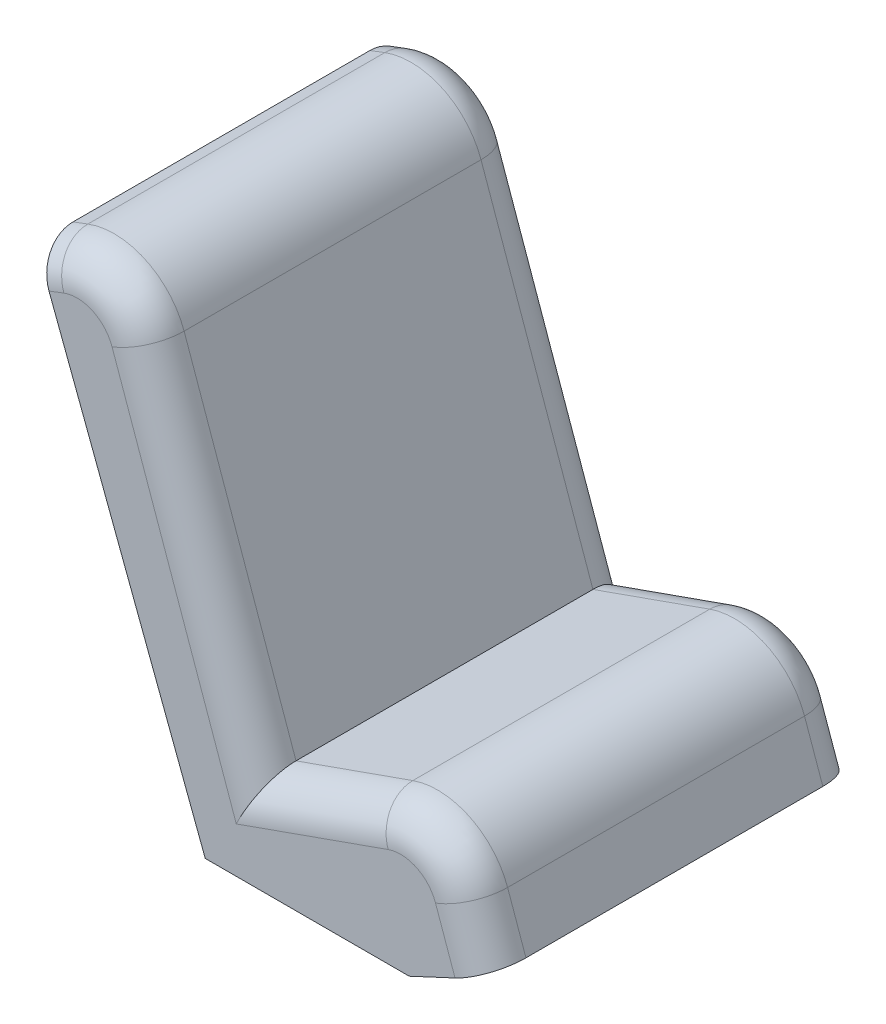
ISO-10303-21;
HEADER;
FILE_DESCRIPTION(('STEP AP214'),'2;1');
FILE_NAME('part.step','',(''),(''),'','','');
FILE_SCHEMA(('AUTOMOTIVE_DESIGN { 1 0 10303 214 1 1 1 1 }'));
ENDSEC;
DATA;
#1=APPLICATION_CONTEXT('core data for automotive mechanical design processes');
#2=APPLICATION_PROTOCOL_DEFINITION('international standard','automotive_design',2000,#1);
#3=PRODUCT_CONTEXT('',#1,'mechanical');
#4=PRODUCT('Part','Part','',(#3));
#5=PRODUCT_RELATED_PRODUCT_CATEGORY('part','',(#4));
#6=PRODUCT_DEFINITION_FORMATION('','',#4);
#7=PRODUCT_DEFINITION_CONTEXT('part definition',#1,'design');
#8=PRODUCT_DEFINITION('design','',#6,#7);
#9=PRODUCT_DEFINITION_SHAPE('','',#8);
#10=(LENGTH_UNIT() NAMED_UNIT(*) SI_UNIT(.MILLI.,.METRE.));
#11=(NAMED_UNIT(*) PLANE_ANGLE_UNIT() SI_UNIT($,.RADIAN.));
#12=(NAMED_UNIT(*) SI_UNIT($,.STERADIAN.) SOLID_ANGLE_UNIT());
#13=UNCERTAINTY_MEASURE_WITH_UNIT(LENGTH_MEASURE(1.E-05),#10,'distance_accuracy_value','');
#14=(GEOMETRIC_REPRESENTATION_CONTEXT(3) GLOBAL_UNCERTAINTY_ASSIGNED_CONTEXT((#13)) GLOBAL_UNIT_ASSIGNED_CONTEXT((#10,
#11,#12)) REPRESENTATION_CONTEXT('',''));
#15=CARTESIAN_POINT('',(0.,0.,0.));
#16=DIRECTION('',(0.,0.,1.));
#17=DIRECTION('',(1.,0.,0.));
#18=AXIS2_PLACEMENT_3D('',#15,#16,#17);
#19=CARTESIAN_POINT('',(-39.4836722180552,122.226530820295,50.));
#20=DIRECTION('',(0.353666770270367,-0.935371485350354,0.));
#21=DIRECTION('',(0.935371485350354,0.353666770270367,0.));
#22=AXIS2_PLACEMENT_3D('',#19,#20,#21);
#23=PLANE('',#22);
#24=DIRECTION('',(-0.935371485350354,-0.353666770270367,0.));
#25=VECTOR('',#24,1.);
#26=CARTESIAN_POINT('',(-39.4836722180552,122.226530820295,-40.));
#27=LINE('',#26,#25);
#28=CARTESIAN_POINT('',(-39.4836722180552,122.226530820295,-40.));
#29=VERTEX_POINT('',#28);
#30=CARTESIAN_POINT('',(-43.5016177406668,120.707333540541,-40.));
#31=VERTEX_POINT('',#30);
#32=EDGE_CURVE('E259',#29,#31,#27,.T.);
#33=ORIENTED_EDGE('',*,*,#32,.T.);
#34=DIRECTION('',(0.,0.,1.));
#35=VECTOR('',#34,1.);
#36=CARTESIAN_POINT('',(-43.5016177406668,120.707333540541,50.));
#37=LINE('',#36,#35);
#38=CARTESIAN_POINT('',(-43.5016177406668,120.707333540541,40.));
#39=VERTEX_POINT('',#38);
#40=EDGE_CURVE('E57',#31,#39,#37,.T.);
#41=ORIENTED_EDGE('',*,*,#40,.T.);
#42=DIRECTION('',(-0.935371485350354,-0.353666770270367,0.));
#43=VECTOR('',#42,1.);
#44=CARTESIAN_POINT('',(-39.4836722180552,122.226530820295,40.));
#45=LINE('',#44,#43);
#46=CARTESIAN_POINT('',(-39.4836722180552,122.226530820295,40.));
#47=VERTEX_POINT('',#46);
#48=EDGE_CURVE('E257',#39,#47,#45,.F.);
#49=ORIENTED_EDGE('',*,*,#48,.T.);
#50=DIRECTION('',(0.,0.,-1.));
#51=VECTOR('',#50,1.);
#52=CARTESIAN_POINT('',(-39.4836722180552,122.226530820295,50.));
#53=LINE('',#52,#51);
#54=EDGE_CURVE('E194',#47,#29,#53,.T.);
#55=ORIENTED_EDGE('',*,*,#54,.T.);
#56=EDGE_LOOP('',(#33,#41,#49,#55));
#57=FACE_BOUND('',#56,.T.);
#58=ADVANCED_FACE('F33',(#57),#23,.F.);
#59=CARTESIAN_POINT('',(-45.3723607113675,120.,50.));
#60=DIRECTION('',(0.935371485350354,0.353666770270366,0.));
#61=DIRECTION('',(-0.353666770270366,0.935371485350355,0.));
#62=AXIS2_PLACEMENT_3D('',#59,#60,#61);
#63=PLANE('',#62);
#64=CARTESIAN_POINT('',(-41.8356930086638,110.646285146496,-40.));
#65=DIRECTION('',(0.935371485350354,0.353666770270366,0.));
#66=DIRECTION('',(-0.353666770270366,0.935371485350355,0.));
#67=AXIS2_PLACEMENT_3D('',#64,#65,#66);
#68=CIRCLE('',#67,7.99999999999999);
#69=CARTESIAN_POINT('',(-44.6650271708267,118.129257029299,-40.));
#70=VERTEX_POINT('',#69);
#71=CARTESIAN_POINT('',(-41.8356930086638,110.646285146496,-48.));
#72=VERTEX_POINT('',#71);
#73=EDGE_CURVE('E307',#70,#72,#68,.F.);
#74=ORIENTED_EDGE('',*,*,#73,.T.);
#75=DIRECTION('',(0.353666770270366,-0.935371485350355,0.));
#76=VECTOR('',#75,1.);
#77=CARTESIAN_POINT('',(-45.3723607113675,120.,-48.));
#78=LINE('',#77,#76);
#79=CARTESIAN_POINT('',(0.,0.,-48.));
#80=VERTEX_POINT('',#79);
#81=EDGE_CURVE('E309',#72,#80,#78,.T.);
#82=ORIENTED_EDGE('',*,*,#81,.T.);
#83=DIRECTION('',(0.,0.,-1.));
#84=VECTOR('',#83,1.);
#85=CARTESIAN_POINT('',(0.,0.,50.));
#86=LINE('',#85,#84);
#87=CARTESIAN_POINT('',(0.,0.,48.));
#88=VERTEX_POINT('',#87);
#89=EDGE_CURVE('E187',#88,#80,#86,.T.);
#90=ORIENTED_EDGE('',*,*,#89,.F.);
#91=DIRECTION('',(-0.353666770270366,0.935371485350355,0.));
#92=VECTOR('',#91,1.);
#93=CARTESIAN_POINT('',(-41.8356930086638,110.646285146496,48.));
#94=LINE('',#93,#92);
#95=CARTESIAN_POINT('',(-41.8356930086638,110.646285146496,48.));
#96=VERTEX_POINT('',#95);
#97=EDGE_CURVE('E273',#88,#96,#94,.T.);
#98=ORIENTED_EDGE('',*,*,#97,.T.);
#99=CARTESIAN_POINT('',(-41.8356930086638,110.646285146496,40.));
#100=DIRECTION('',(0.935371485350354,0.353666770270366,0.));
#101=DIRECTION('',(-0.353666770270366,0.935371485350355,0.));
#102=AXIS2_PLACEMENT_3D('',#99,#100,#101);
#103=CIRCLE('',#102,8.);
#104=CARTESIAN_POINT('',(-44.6650271708267,118.129257029299,40.));
#105=VERTEX_POINT('',#104);
#106=EDGE_CURVE('E303',#96,#105,#103,.F.);
#107=ORIENTED_EDGE('',*,*,#106,.T.);
#108=DIRECTION('',(0.,0.,-1.));
#109=VECTOR('',#108,1.);
#110=CARTESIAN_POINT('',(-44.6650271708267,118.129257029299,50.));
#111=LINE('',#110,#109);
#112=EDGE_CURVE('E305',#105,#70,#111,.T.);
#113=ORIENTED_EDGE('',*,*,#112,.T.);
#114=EDGE_LOOP('',(#74,#82,#90,#98,#107,#113));
#115=FACE_BOUND('',#114,.T.);
#116=ADVANCED_FACE('F341',(#115),#63,.F.);
#117=CARTESIAN_POINT('',(0.,0.,50.));
#118=DIRECTION('',(0.,1.,0.));
#119=DIRECTION('',(0.,0.,1.));
#120=AXIS2_PLACEMENT_3D('',#117,#118,#119);
#121=PLANE('',#120);
#122=CARTESIAN_POINT('',(30.,0.,0.));
#123=DIRECTION('',(0.,1.,0.));
#124=DIRECTION('',(0.,0.,1.));
#125=AXIS2_PLACEMENT_3D('',#122,#123,#124);
#126=CIRCLE('',#125,7.5);
#127=CARTESIAN_POINT('',(30.,0.,7.5));
#128=VERTEX_POINT('',#127);
#129=EDGE_CURVE('E218',#128,#128,#126,.F.);
#130=ORIENTED_EDGE('',*,*,#129,.F.);
#131=EDGE_LOOP('',(#130));
#132=FACE_BOUND('',#131,.T.);
#133=ORIENTED_EDGE('',*,*,#89,.T.);
#134=DIRECTION('',(-0.730312359414806,0.,0.683113356395539));
#135=VECTOR('',#134,1.);
#136=CARTESIAN_POINT('',(-24.1996272766952,0.,-25.364358689273));
#137=LINE('',#136,#135);
#138=CARTESIAN_POINT('',(2.13818790857292,0.,-50.));
#139=VERTEX_POINT('',#138);
#140=EDGE_CURVE('E314',#80,#139,#137,.F.);
#141=ORIENTED_EDGE('',*,*,#140,.T.);
#142=DIRECTION('',(1.,0.,0.));
#143=VECTOR('',#142,1.);
#144=CARTESIAN_POINT('',(0.,0.,-50.));
#145=LINE('',#144,#143);
#146=CARTESIAN_POINT('',(57.1,0.,-50.));
#147=VERTEX_POINT('',#146);
#148=EDGE_CURVE('E183',#139,#147,#145,.T.);
#149=ORIENTED_EDGE('',*,*,#148,.T.);
#150=DIRECTION('',(0.,0.,-1.));
#151=VECTOR('',#150,1.);
#152=CARTESIAN_POINT('',(57.1,0.,50.));
#153=LINE('',#152,#151);
#154=CARTESIAN_POINT('',(57.1,0.,50.));
#155=VERTEX_POINT('',#154);
#156=EDGE_CURVE('E179',#155,#147,#153,.T.);
#157=ORIENTED_EDGE('',*,*,#156,.F.);
#158=DIRECTION('',(1.,0.,0.));
#159=VECTOR('',#158,1.);
#160=CARTESIAN_POINT('',(0.,0.,50.));
#161=LINE('',#160,#159);
#162=CARTESIAN_POINT('',(2.13818790857292,0.,50.));
#163=VERTEX_POINT('',#162);
#164=EDGE_CURVE('E166',#163,#155,#161,.T.);
#165=ORIENTED_EDGE('',*,*,#164,.F.);
#166=DIRECTION('',(-0.730312359414806,0.,-0.683113356395539));
#167=VECTOR('',#166,1.);
#168=CARTESIAN_POINT('',(2.5977246242426,0.,50.429837540309));
#169=LINE('',#168,#167);
#170=EDGE_CURVE('E312',#163,#88,#169,.T.);
#171=ORIENTED_EDGE('',*,*,#170,.T.);
#172=EDGE_LOOP('',(#133,#141,#149,#157,#165,#171));
#173=FACE_BOUND('',#172,.T.);
#174=ADVANCED_FACE('F181',(#132,#173),#121,.F.);
#175=CARTESIAN_POINT('',(57.1,0.,50.));
#176=DIRECTION('',(-0.422618261740701,0.906307787036649,0.));
#177=DIRECTION('',(-0.906307787036649,-0.422618261740701,0.));
#178=AXIS2_PLACEMENT_3D('',#175,#176,#177);
#179=PLANE('',#178);
#180=DIRECTION('',(0.906307787036649,0.422618261740701,0.));
#181=VECTOR('',#180,1.);
#182=CARTESIAN_POINT('',(57.1,0.,-50.));
#183=LINE('',#182,#181);
#184=CARTESIAN_POINT('',(69.4398904161345,5.75418540183703,-50.));
#185=VERTEX_POINT('',#184);
#186=EDGE_CURVE('E176',#147,#185,#183,.T.);
#187=ORIENTED_EDGE('',*,*,#186,.T.);
#188=CARTESIAN_POINT('',(69.4398904161345,5.75418540183703,-40.));
#189=DIRECTION('',(-0.422618261740701,0.906307787036649,0.));
#190=DIRECTION('',(0.906307787036649,0.422618261740701,0.));
#191=AXIS2_PLACEMENT_3D('',#188,#189,#190);
#192=ELLIPSE('',#191,10.0464532239452,10.);
#193=CARTESIAN_POINT('',(78.5450692050955,10.,-40.));
#194=VERTEX_POINT('',#193);
#195=EDGE_CURVE('E239',#185,#194,#192,.F.);
#196=ORIENTED_EDGE('',*,*,#195,.T.);
#197=DIRECTION('',(0.,0.,-1.));
#198=VECTOR('',#197,1.);
#199=CARTESIAN_POINT('',(78.5450692050955,10.,50.));
#200=LINE('',#199,#198);
#201=CARTESIAN_POINT('',(78.5450692050955,10.,40.));
#202=VERTEX_POINT('',#201);
#203=EDGE_CURVE('E188',#202,#194,#200,.T.);
#204=ORIENTED_EDGE('',*,*,#203,.F.);
#205=CARTESIAN_POINT('',(69.4398904161345,5.75418540183703,40.));
#206=DIRECTION('',(-0.422618261740701,0.906307787036649,0.));
#207=DIRECTION('',(-0.906307787036649,-0.422618261740701,0.));
#208=AXIS2_PLACEMENT_3D('',#205,#206,#207);
#209=ELLIPSE('',#208,10.0464532239452,10.);
#210=CARTESIAN_POINT('',(69.4398904161345,5.75418540183703,50.));
#211=VERTEX_POINT('',#210);
#212=EDGE_CURVE('E193',#202,#211,#209,.F.);
#213=ORIENTED_EDGE('',*,*,#212,.T.);
#214=DIRECTION('',(0.906307787036649,0.422618261740701,0.));
#215=VECTOR('',#214,1.);
#216=CARTESIAN_POINT('',(57.1,0.,50.));
#217=LINE('',#216,#215);
#218=EDGE_CURVE('E171',#155,#211,#217,.T.);
#219=ORIENTED_EDGE('',*,*,#218,.F.);
#220=ORIENTED_EDGE('',*,*,#156,.T.);
#221=EDGE_LOOP('',(#187,#196,#204,#213,#219,#220));
#222=FACE_BOUND('',#221,.T.);
#223=ADVANCED_FACE('F190',(#222),#179,.F.);
#224=CARTESIAN_POINT('',(78.5450692050955,10.,50.));
#225=DIRECTION('',(-0.942711194520251,-0.333609957474595,0.));
#226=DIRECTION('',(0.333609957474595,-0.942711194520251,0.));
#227=AXIS2_PLACEMENT_3D('',#224,#225,#226);
#228=PLANE('',#227);
#229=ORIENTED_EDGE('',*,*,#203,.T.);
#230=DIRECTION('',(-0.333609957474595,0.942711194520251,0.));
#231=VECTOR('',#230,1.);
#232=CARTESIAN_POINT('',(78.5450692050955,10.,-40.));
#233=LINE('',#232,#231);
#234=CARTESIAN_POINT('',(73.6046613708874,23.9605478387383,-40.));
#235=VERTEX_POINT('',#234);
#236=EDGE_CURVE('E223',#194,#235,#233,.T.);
#237=ORIENTED_EDGE('',*,*,#236,.T.);
#238=DIRECTION('',(0.,0.,-1.));
#239=VECTOR('',#238,1.);
#240=CARTESIAN_POINT('',(73.6046613708874,23.9605478387383,50.));
#241=LINE('',#240,#239);
#242=CARTESIAN_POINT('',(73.6046613708874,23.9605478387383,40.));
#243=VERTEX_POINT('',#242);
#244=EDGE_CURVE('E212',#243,#235,#241,.T.);
#245=ORIENTED_EDGE('',*,*,#244,.F.);
#246=DIRECTION('',(-0.333609957474595,0.942711194520251,0.));
#247=VECTOR('',#246,1.);
#248=CARTESIAN_POINT('',(78.5450692050955,10.,40.));
#249=LINE('',#248,#247);
#250=EDGE_CURVE('E221',#243,#202,#249,.F.);
#251=ORIENTED_EDGE('',*,*,#250,.T.);
#252=EDGE_LOOP('',(#229,#237,#245,#251));
#253=FACE_BOUND('',#252,.T.);
#254=ADVANCED_FACE('F360',(#253),#228,.F.);
#255=CARTESIAN_POINT('',(54.7504374804824,17.2883486892464,50.));
#256=DIRECTION('',(0.,0.,-1.));
#257=DIRECTION('',(-1.,0.,0.));
#258=AXIS2_PLACEMENT_3D('',#255,#256,#257);
#259=CYLINDRICAL_SURFACE('',#258,20.);
#260=ORIENTED_EDGE('',*,*,#244,.T.);
#261=CARTESIAN_POINT('',(54.7504374804824,17.2883486892464,-40.));
#262=DIRECTION('',(0.,0.,1.));
#263=DIRECTION('',(1.,0.,0.));
#264=AXIS2_PLACEMENT_3D('',#261,#262,#263);
#265=CIRCLE('',#264,20.);
#266=CARTESIAN_POINT('',(48.0782383309905,36.1425725796514,-40.));
#267=VERTEX_POINT('',#266);
#268=EDGE_CURVE('E243',#235,#267,#265,.T.);
#269=ORIENTED_EDGE('',*,*,#268,.T.);
#270=DIRECTION('',(0.,0.,-1.));
#271=VECTOR('',#270,1.);
#272=CARTESIAN_POINT('',(48.0782383309905,36.1425725796514,50.));
#273=LINE('',#272,#271);
#274=CARTESIAN_POINT('',(48.0782383309905,36.1425725796514,40.));
#275=VERTEX_POINT('',#274);
#276=EDGE_CURVE('E209',#275,#267,#273,.T.);
#277=ORIENTED_EDGE('',*,*,#276,.F.);
#278=CARTESIAN_POINT('',(54.7504374804824,17.2883486892464,40.));
#279=DIRECTION('',(0.,0.,1.));
#280=DIRECTION('',(1.,0.,0.));
#281=AXIS2_PLACEMENT_3D('',#278,#279,#280);
#282=CIRCLE('',#281,20.);
#283=EDGE_CURVE('E241',#275,#243,#282,.F.);
#284=ORIENTED_EDGE('',*,*,#283,.T.);
#285=EDGE_LOOP('',(#260,#269,#277,#284));
#286=FACE_BOUND('',#285,.T.);
#287=ADVANCED_FACE('F363',(#286),#259,.T.);
#288=CARTESIAN_POINT('',(48.0782383309905,36.1425725796514,50.));
#289=DIRECTION('',(0.333609957474594,-0.942711194520252,0.));
#290=DIRECTION('',(0.942711194520252,0.333609957474594,0.));
#291=AXIS2_PLACEMENT_3D('',#288,#289,#290);
#292=PLANE('',#291);
#293=ORIENTED_EDGE('',*,*,#276,.T.);
#294=DIRECTION('',(-0.942711194520252,-0.333609957474594,0.));
#295=VECTOR('',#294,1.);
#296=CARTESIAN_POINT('',(48.0782383309905,36.1425725796514,-40.));
#297=LINE('',#296,#295);
#298=CARTESIAN_POINT('',(16.5916844340141,25.,-40.));
#299=VERTEX_POINT('',#298);
#300=EDGE_CURVE('E267',#267,#299,#297,.T.);
#301=ORIENTED_EDGE('',*,*,#300,.T.);
#302=DIRECTION('',(0.,0.,-1.));
#303=VECTOR('',#302,1.);
#304=CARTESIAN_POINT('',(16.5916844340141,25.,50.));
#305=LINE('',#304,#303);
#306=CARTESIAN_POINT('',(16.5916844340141,25.,40.));
#307=VERTEX_POINT('',#306);
#308=EDGE_CURVE('E206',#307,#299,#305,.T.);
#309=ORIENTED_EDGE('',*,*,#308,.F.);
#310=DIRECTION('',(-0.942711194520252,-0.333609957474594,0.));
#311=VECTOR('',#310,1.);
#312=CARTESIAN_POINT('',(48.0782383309905,36.1425725796514,40.));
#313=LINE('',#312,#311);
#314=EDGE_CURVE('E265',#307,#275,#313,.F.);
#315=ORIENTED_EDGE('',*,*,#314,.T.);
#316=EDGE_LOOP('',(#293,#301,#309,#315));
#317=FACE_BOUND('',#316,.T.);
#318=ADVANCED_FACE('F602',(#317),#292,.F.);
#319=CARTESIAN_POINT('',(16.5916844340141,25.,50.));
#320=DIRECTION('',(-0.942711194520251,-0.333609957474595,0.));
#321=DIRECTION('',(0.333609957474595,-0.942711194520251,0.));
#322=AXIS2_PLACEMENT_3D('',#319,#320,#321);
#323=PLANE('',#322);
#324=ORIENTED_EDGE('',*,*,#308,.T.);
#325=DIRECTION('',(-0.333609957474595,0.942711194520251,0.));
#326=VECTOR('',#325,1.);
#327=CARTESIAN_POINT('',(16.5916844340141,25.,-40.));
#328=LINE('',#327,#326);
#329=CARTESIAN_POINT('',(-13.5561129222429,110.19130026278,-40.));
#330=VERTEX_POINT('',#329);
#331=EDGE_CURVE('E271',#299,#330,#328,.T.);
#332=ORIENTED_EDGE('',*,*,#331,.T.);
#333=DIRECTION('',(0.,0.,-1.));
#334=VECTOR('',#333,1.);
#335=CARTESIAN_POINT('',(-13.5561129222429,110.19130026278,50.));
#336=LINE('',#335,#334);
#337=CARTESIAN_POINT('',(-13.5561129222429,110.19130026278,40.));
#338=VERTEX_POINT('',#337);
#339=EDGE_CURVE('E197',#338,#330,#336,.T.);
#340=ORIENTED_EDGE('',*,*,#339,.F.);
#341=DIRECTION('',(-0.333609957474595,0.942711194520251,0.));
#342=VECTOR('',#341,1.);
#343=CARTESIAN_POINT('',(16.5916844340141,25.,40.));
#344=LINE('',#343,#342);
#345=EDGE_CURVE('E269',#338,#307,#344,.F.);
#346=ORIENTED_EDGE('',*,*,#345,.T.);
#347=EDGE_LOOP('',(#324,#332,#340,#346));
#348=FACE_BOUND('',#347,.T.);
#349=ADVANCED_FACE('F594',(#348),#323,.F.);
#350=CARTESIAN_POINT('',(-32.4103368126477,103.519101113288,50.));
#351=DIRECTION('',(0.,0.,-1.));
#352=DIRECTION('',(-1.,0.,0.));
#353=AXIS2_PLACEMENT_3D('',#350,#351,#352);
#354=CYLINDRICAL_SURFACE('',#353,19.9999999999999);
#355=ORIENTED_EDGE('',*,*,#339,.T.);
#356=CARTESIAN_POINT('',(-32.4103368126477,103.519101113288,-40.));
#357=DIRECTION('',(0.,0.,1.));
#358=DIRECTION('',(1.,0.,0.));
#359=AXIS2_PLACEMENT_3D('',#356,#357,#358);
#360=CIRCLE('',#359,19.9999999999999);
#361=EDGE_CURVE('E263',#330,#29,#360,.T.);
#362=ORIENTED_EDGE('',*,*,#361,.T.);
#363=ORIENTED_EDGE('',*,*,#54,.F.);
#364=CARTESIAN_POINT('',(-32.4103368126477,103.519101113288,40.));
#365=DIRECTION('',(0.,0.,1.));
#366=DIRECTION('',(1.,0.,0.));
#367=AXIS2_PLACEMENT_3D('',#364,#365,#366);
#368=CIRCLE('',#367,19.9999999999999);
#369=EDGE_CURVE('E261',#47,#338,#368,.F.);
#370=ORIENTED_EDGE('',*,*,#369,.T.);
#371=EDGE_LOOP('',(#355,#362,#363,#370));
#372=FACE_BOUND('',#371,.T.);
#373=ADVANCED_FACE('F392',(#372),#354,.T.);
#374=CARTESIAN_POINT('',(54.7504374804824,17.2883486892464,50.));
#375=DIRECTION('',(0.,0.,1.));
#376=DIRECTION('',(1.,0.,0.));
#377=AXIS2_PLACEMENT_3D('',#374,#375,#376);
#378=PLANE('',#377);
#379=DIRECTION('',(-0.935371485350354,-0.353666770270367,0.));
#380=VECTOR('',#379,1.);
#381=CARTESIAN_POINT('',(-41.8356930086638,110.646285146496,50.));
#382=LINE('',#381,#380);
#383=CARTESIAN_POINT('',(-35.9470045153515,112.872815966792,50.));
#384=VERTEX_POINT('',#383);
#385=CARTESIAN_POINT('',(-39.9649500379631,111.353618687037,50.));
#386=VERTEX_POINT('',#385);
#387=EDGE_CURVE('E251',#384,#386,#382,.T.);
#388=ORIENTED_EDGE('',*,*,#387,.T.);
#389=DIRECTION('',(0.353666770270366,-0.935371485350355,0.));
#390=VECTOR('',#389,1.);
#391=CARTESIAN_POINT('',(1.87074297070073,0.70733354054074,50.));
#392=LINE('',#391,#390);
#393=EDGE_CURVE('E11',#386,#163,#392,.T.);
#394=ORIENTED_EDGE('',*,*,#393,.T.);
#395=ORIENTED_EDGE('',*,*,#164,.T.);
#396=ORIENTED_EDGE('',*,*,#218,.T.);
#397=DIRECTION('',(-0.333609957474595,0.942711194520251,0.));
#398=VECTOR('',#397,1.);
#399=CARTESIAN_POINT('',(64.1775494256849,20.6244482639923,50.));
#400=LINE('',#399,#398);
#401=CARTESIAN_POINT('',(64.1775494256849,20.6244482639923,50.));
#402=VERTEX_POINT('',#401);
#403=EDGE_CURVE('E255',#211,#402,#400,.T.);
#404=ORIENTED_EDGE('',*,*,#403,.T.);
#405=CARTESIAN_POINT('',(54.7504374804824,17.2883486892464,50.));
#406=DIRECTION('',(0.,0.,1.));
#407=DIRECTION('',(1.,0.,0.));
#408=AXIS2_PLACEMENT_3D('',#405,#406,#407);
#409=CIRCLE('',#408,10.);
#410=CARTESIAN_POINT('',(51.4143379057364,26.7154606344489,50.));
#411=VERTEX_POINT('',#410);
#412=EDGE_CURVE('E253',#402,#411,#409,.T.);
#413=ORIENTED_EDGE('',*,*,#412,.T.);
#414=DIRECTION('',(-0.942711194520252,-0.333609957474594,0.));
#415=VECTOR('',#414,1.);
#416=CARTESIAN_POINT('',(19.9277840087601,15.5728880547975,50.));
#417=LINE('',#416,#415);
#418=CARTESIAN_POINT('',(10.5006720635576,12.2367884800516,50.));
#419=VERTEX_POINT('',#418);
#420=EDGE_CURVE('E247',#411,#419,#417,.T.);
#421=ORIENTED_EDGE('',*,*,#420,.T.);
#422=DIRECTION('',(-0.333609957474595,0.942711194520251,0.));
#423=VECTOR('',#422,1.);
#424=CARTESIAN_POINT('',(-22.9832248674454,106.855200688034,50.));
#425=LINE('',#424,#423);
#426=CARTESIAN_POINT('',(-22.9832248674454,106.855200688034,50.));
#427=VERTEX_POINT('',#426);
#428=EDGE_CURVE('E245',#419,#427,#425,.T.);
#429=ORIENTED_EDGE('',*,*,#428,.T.);
#430=CARTESIAN_POINT('',(-32.4103368126477,103.519101113288,50.));
#431=DIRECTION('',(0.,0.,1.));
#432=DIRECTION('',(1.,0.,0.));
#433=AXIS2_PLACEMENT_3D('',#430,#431,#432);
#434=CIRCLE('',#433,9.99999999999989);
#435=EDGE_CURVE('E249',#427,#384,#434,.T.);
#436=ORIENTED_EDGE('',*,*,#435,.T.);
#437=EDGE_LOOP('',(#388,#394,#395,#396,#404,#413,#421,#429,#436));
#438=FACE_BOUND('',#437,.T.);
#439=ADVANCED_FACE('F168',(#438),#378,.T.);
#440=CARTESIAN_POINT('',(54.7504374804824,17.2883486892464,-50.));
#441=DIRECTION('',(0.,0.,1.));
#442=DIRECTION('',(1.,0.,0.));
#443=AXIS2_PLACEMENT_3D('',#440,#441,#442);
#444=PLANE('',#443);
#445=ORIENTED_EDGE('',*,*,#148,.F.);
#446=DIRECTION('',(-0.353666770270366,0.935371485350355,0.));
#447=VECTOR('',#446,1.);
#448=CARTESIAN_POINT('',(2.99978240278075,-2.27872955437897,-50.));
#449=LINE('',#448,#447);
#450=CARTESIAN_POINT('',(-39.9649500379631,111.353618687037,-50.));
#451=VERTEX_POINT('',#450);
#452=EDGE_CURVE('E316',#139,#451,#449,.T.);
#453=ORIENTED_EDGE('',*,*,#452,.T.);
#454=DIRECTION('',(-0.935371485350354,-0.353666770270367,0.));
#455=VECTOR('',#454,1.);
#456=CARTESIAN_POINT('',(11.7857050397384,130.920696930663,-50.));
#457=LINE('',#456,#455);
#458=CARTESIAN_POINT('',(-35.9470045153515,112.872815966792,-50.));
#459=VERTEX_POINT('',#458);
#460=EDGE_CURVE('E232',#451,#459,#457,.F.);
#461=ORIENTED_EDGE('',*,*,#460,.T.);
#462=CARTESIAN_POINT('',(-32.4103368126477,103.519101113288,-50.));
#463=DIRECTION('',(0.,0.,1.));
#464=DIRECTION('',(1.,0.,0.));
#465=AXIS2_PLACEMENT_3D('',#462,#463,#464);
#466=CIRCLE('',#465,9.99999999999989);
#467=CARTESIAN_POINT('',(-22.9832248674454,106.855200688034,-50.));
#468=VERTEX_POINT('',#467);
#469=EDGE_CURVE('E230',#459,#468,#466,.F.);
#470=ORIENTED_EDGE('',*,*,#469,.T.);
#471=DIRECTION('',(-0.333609957474595,0.942711194520251,0.));
#472=VECTOR('',#471,1.);
#473=CARTESIAN_POINT('',(13.8367716383036,2.80967653484895,-50.));
#474=LINE('',#473,#472);
#475=CARTESIAN_POINT('',(10.5006720635576,12.2367884800515,-50.));
#476=VERTEX_POINT('',#475);
#477=EDGE_CURVE('E226',#468,#476,#474,.F.);
#478=ORIENTED_EDGE('',*,*,#477,.T.);
#479=DIRECTION('',(-0.942711194520252,-0.333609957474594,0.));
#480=VECTOR('',#479,1.);
#481=CARTESIAN_POINT('',(51.4143379057364,26.7154606344489,-50.));
#482=LINE('',#481,#480);
#483=CARTESIAN_POINT('',(51.4143379057364,26.7154606344489,-50.));
#484=VERTEX_POINT('',#483);
#485=EDGE_CURVE('E228',#476,#484,#482,.F.);
#486=ORIENTED_EDGE('',*,*,#485,.T.);
#487=CARTESIAN_POINT('',(54.7504374804824,17.2883486892464,-50.));
#488=DIRECTION('',(0.,0.,1.));
#489=DIRECTION('',(1.,0.,0.));
#490=AXIS2_PLACEMENT_3D('',#487,#488,#489);
#491=CIRCLE('',#490,10.);
#492=CARTESIAN_POINT('',(64.1775494256849,20.6244482639923,-50.));
#493=VERTEX_POINT('',#492);
#494=EDGE_CURVE('E234',#484,#493,#491,.F.);
#495=ORIENTED_EDGE('',*,*,#494,.T.);
#496=DIRECTION('',(-0.333609957474595,0.942711194520251,0.));
#497=VECTOR('',#496,1.);
#498=CARTESIAN_POINT('',(64.1775494256849,20.6244482639923,-50.));
#499=LINE('',#498,#497);
#500=EDGE_CURVE('E236',#493,#185,#499,.F.);
#501=ORIENTED_EDGE('',*,*,#500,.T.);
#502=ORIENTED_EDGE('',*,*,#186,.F.);
#503=EDGE_LOOP('',(#445,#453,#461,#470,#478,#486,#495,#501,#502));
#504=FACE_BOUND('',#503,.T.);
#505=ADVANCED_FACE('F349',(#504),#444,.F.);
#506=CARTESIAN_POINT('',(30.,-10.,0.));
#507=DIRECTION('',(0.,1.,0.));
#508=DIRECTION('',(0.,0.,1.));
#509=AXIS2_PLACEMENT_3D('',#506,#507,#508);
#510=CYLINDRICAL_SURFACE('',#509,7.5);
#511=CARTESIAN_POINT('',(30.,-10.,0.));
#512=DIRECTION('',(0.,-1.,0.));
#513=DIRECTION('',(0.,0.,-1.));
#514=AXIS2_PLACEMENT_3D('',#511,#512,#513);
#515=CIRCLE('',#514,7.5);
#516=CARTESIAN_POINT('',(30.,-10.,-7.5));
#517=VERTEX_POINT('',#516);
#518=EDGE_CURVE('E202',#517,#517,#515,.T.);
#519=ORIENTED_EDGE('',*,*,#518,.F.);
#520=EDGE_LOOP('',(#519));
#521=FACE_BOUND('',#520,.T.);
#522=ORIENTED_EDGE('',*,*,#129,.T.);
#523=EDGE_LOOP('',(#522));
#524=FACE_BOUND('',#523,.T.);
#525=ADVANCED_FACE('F563',(#521,#524),#510,.T.);
#526=CARTESIAN_POINT('',(30.,-10.,0.));
#527=DIRECTION('',(0.,-1.,0.));
#528=DIRECTION('',(0.,0.,-1.));
#529=AXIS2_PLACEMENT_3D('',#526,#527,#528);
#530=PLANE('',#529);
#531=ORIENTED_EDGE('',*,*,#518,.T.);
#532=EDGE_LOOP('',(#531));
#533=FACE_BOUND('',#532,.T.);
#534=ADVANCED_FACE('F446',(#533),#530,.T.);
#535=CARTESIAN_POINT('',(-35.9470045153516,112.872815966792,-40.));
#536=DIRECTION('',(-0.935371485350354,-0.353666770270367,0.));
#537=DIRECTION('',(0.353666770270367,-0.935371485350354,0.));
#538=AXIS2_PLACEMENT_3D('',#535,#536,#537);
#539=CYLINDRICAL_SURFACE('',#538,10.);
#540=ORIENTED_EDGE('',*,*,#460,.F.);
#541=CARTESIAN_POINT('',(-39.9649500379631,111.353618687037,-40.));
#542=DIRECTION('',(0.935371485350356,0.353666770270362,0.));
#543=DIRECTION('',(-0.353666770270362,0.935371485350356,0.));
#544=AXIS2_PLACEMENT_3D('',#541,#542,#543);
#545=CIRCLE('',#544,10.);
#546=EDGE_CURVE('E318',#451,#31,#545,.T.);
#547=ORIENTED_EDGE('',*,*,#546,.T.);
#548=ORIENTED_EDGE('',*,*,#32,.F.);
#549=CARTESIAN_POINT('',(-35.9470045153516,112.872815966792,-40.));
#550=DIRECTION('',(0.935371485350354,0.353666770270367,0.));
#551=DIRECTION('',(-0.353666770270367,0.935371485350354,0.));
#552=AXIS2_PLACEMENT_3D('',#549,#550,#551);
#553=CIRCLE('',#552,10.);
#554=EDGE_CURVE('E286',#459,#29,#553,.T.);
#555=ORIENTED_EDGE('',*,*,#554,.F.);
#556=EDGE_LOOP('',(#540,#547,#548,#555));
#557=FACE_BOUND('',#556,.T.);
#558=ADVANCED_FACE('F409',(#557),#539,.T.);
#559=CARTESIAN_POINT('',(-32.4103368126477,103.519101113288,-40.));
#560=DIRECTION('',(0.,0.,1.));
#561=DIRECTION('',(1.,0.,0.));
#562=AXIS2_PLACEMENT_3D('',#559,#560,#561);
#563=DEGENERATE_TOROIDAL_SURFACE('',#562,9.99999999999989,10.,.T.);
#564=ORIENTED_EDGE('',*,*,#554,.T.);
#565=ORIENTED_EDGE('',*,*,#361,.F.);
#566=CARTESIAN_POINT('',(-22.9832248674453,106.855200688034,-40.));
#567=DIRECTION('',(0.333609957474594,-0.942711194520252,0.));
#568=DIRECTION('',(0.942711194520252,0.333609957474594,0.));
#569=AXIS2_PLACEMENT_3D('',#566,#567,#568);
#570=CIRCLE('',#569,10.);
#571=EDGE_CURVE('E283',#468,#330,#570,.T.);
#572=ORIENTED_EDGE('',*,*,#571,.F.);
#573=ORIENTED_EDGE('',*,*,#469,.F.);
#574=EDGE_LOOP('',(#564,#565,#572,#573));
#575=FACE_BOUND('',#574,.T.);
#576=ADVANCED_FACE('F397',(#575),#563,.T.);
#577=CARTESIAN_POINT('',(7.16457248881163,21.663900425254,-40.));
#578=DIRECTION('',(-0.333609957474595,0.942711194520251,0.));
#579=DIRECTION('',(-0.942711194520251,-0.333609957474595,0.));
#580=AXIS2_PLACEMENT_3D('',#577,#578,#579);
#581=CYLINDRICAL_SURFACE('',#580,10.);
#582=ORIENTED_EDGE('',*,*,#571,.T.);
#583=ORIENTED_EDGE('',*,*,#331,.F.);
#584=CARTESIAN_POINT('',(10.5006720635576,12.2367884800515,-40.));
#585=DIRECTION('',(-0.902495341547382,0.430699615144098,0.));
#586=DIRECTION('',(-0.430699615144098,-0.902495341547382,0.));
#587=AXIS2_PLACEMENT_3D('',#584,#585,#586);
#588=ELLIPSE('',#587,14.1421356237309,10.);
#589=EDGE_CURVE('E280',#476,#299,#588,.F.);
#590=ORIENTED_EDGE('',*,*,#589,.F.);
#591=ORIENTED_EDGE('',*,*,#477,.F.);
#592=EDGE_LOOP('',(#582,#583,#590,#591));
#593=FACE_BOUND('',#592,.T.);
#594=ADVANCED_FACE('F403',(#593),#581,.T.);
#595=CARTESIAN_POINT('',(51.4143379057364,26.7154606344489,-40.));
#596=DIRECTION('',(-0.942711194520252,-0.333609957474594,0.));
#597=DIRECTION('',(0.333609957474594,-0.942711194520252,0.));
#598=AXIS2_PLACEMENT_3D('',#595,#596,#597);
#599=CYLINDRICAL_SURFACE('',#598,10.);
#600=ORIENTED_EDGE('',*,*,#589,.T.);
#601=ORIENTED_EDGE('',*,*,#300,.F.);
#602=CARTESIAN_POINT('',(51.4143379057364,26.7154606344489,-40.));
#603=DIRECTION('',(0.942711194520252,0.333609957474594,0.));
#604=DIRECTION('',(-0.333609957474594,0.942711194520252,0.));
#605=AXIS2_PLACEMENT_3D('',#602,#603,#604);
#606=CIRCLE('',#605,10.);
#607=EDGE_CURVE('E276',#484,#267,#606,.T.);
#608=ORIENTED_EDGE('',*,*,#607,.F.);
#609=ORIENTED_EDGE('',*,*,#485,.F.);
#610=EDGE_LOOP('',(#600,#601,#608,#609));
#611=FACE_BOUND('',#610,.T.);
#612=ADVANCED_FACE('F435',(#611),#599,.T.);
#613=CARTESIAN_POINT('',(54.7504374804824,17.2883486892464,-40.));
#614=DIRECTION('',(0.,0.,1.));
#615=DIRECTION('',(1.,0.,0.));
#616=AXIS2_PLACEMENT_3D('',#613,#614,#615);
#617=TOROIDAL_SURFACE('',#616,10.,10.);
#618=ORIENTED_EDGE('',*,*,#607,.T.);
#619=ORIENTED_EDGE('',*,*,#268,.F.);
#620=CARTESIAN_POINT('',(64.1775494256849,20.6244482639923,-40.));
#621=DIRECTION('',(0.333609957474595,-0.942711194520251,0.));
#622=DIRECTION('',(0.942711194520251,0.333609957474595,0.));
#623=AXIS2_PLACEMENT_3D('',#620,#621,#622);
#624=CIRCLE('',#623,10.);
#625=EDGE_CURVE('E274',#493,#235,#624,.T.);
#626=ORIENTED_EDGE('',*,*,#625,.F.);
#627=ORIENTED_EDGE('',*,*,#494,.F.);
#628=EDGE_LOOP('',(#618,#619,#626,#627));
#629=FACE_BOUND('',#628,.T.);
#630=ADVANCED_FACE('F432',(#629),#617,.T.);
#631=CARTESIAN_POINT('',(69.117957259893,6.66390042525405,-40.));
#632=DIRECTION('',(-0.333609957474595,0.942711194520251,0.));
#633=DIRECTION('',(-0.942711194520251,-0.333609957474595,0.));
#634=AXIS2_PLACEMENT_3D('',#631,#632,#633);
#635=CYLINDRICAL_SURFACE('',#634,10.);
#636=ORIENTED_EDGE('',*,*,#195,.F.);
#637=ORIENTED_EDGE('',*,*,#500,.F.);
#638=ORIENTED_EDGE('',*,*,#625,.T.);
#639=ORIENTED_EDGE('',*,*,#236,.F.);
#640=EDGE_LOOP('',(#636,#637,#638,#639));
#641=FACE_BOUND('',#640,.T.);
#642=ADVANCED_FACE('F355',(#641),#635,.T.);
#643=CARTESIAN_POINT('',(11.7857050397384,130.920696930663,40.));
#644=DIRECTION('',(0.935371485350354,0.353666770270367,0.));
#645=DIRECTION('',(-0.353666770270367,0.935371485350354,0.));
#646=AXIS2_PLACEMENT_3D('',#643,#644,#645);
#647=CYLINDRICAL_SURFACE('',#646,10.);
#648=ORIENTED_EDGE('',*,*,#48,.F.);
#649=CARTESIAN_POINT('',(-39.9649500379631,111.353618687037,40.));
#650=DIRECTION('',(0.935371485350355,0.353666770270366,0.));
#651=DIRECTION('',(-0.353666770270366,0.935371485350355,0.));
#652=AXIS2_PLACEMENT_3D('',#649,#650,#651);
#653=CIRCLE('',#652,10.);
#654=EDGE_CURVE('E42',#39,#386,#653,.T.);
#655=ORIENTED_EDGE('',*,*,#654,.T.);
#656=ORIENTED_EDGE('',*,*,#387,.F.);
#657=CARTESIAN_POINT('',(-35.9470045153516,112.872815966792,40.));
#658=DIRECTION('',(0.935371485350354,0.353666770270367,0.));
#659=DIRECTION('',(-0.353666770270367,0.935371485350354,0.));
#660=AXIS2_PLACEMENT_3D('',#657,#658,#659);
#661=CIRCLE('',#660,10.);
#662=EDGE_CURVE('E277',#47,#384,#661,.T.);
#663=ORIENTED_EDGE('',*,*,#662,.F.);
#664=EDGE_LOOP('',(#648,#655,#656,#663));
#665=FACE_BOUND('',#664,.T.);
#666=ADVANCED_FACE('F388',(#665),#647,.T.);
#667=CARTESIAN_POINT('',(-32.4103368126477,103.519101113288,40.));
#668=DIRECTION('',(0.,0.,1.));
#669=DIRECTION('',(1.,0.,0.));
#670=AXIS2_PLACEMENT_3D('',#667,#668,#669);
#671=DEGENERATE_TOROIDAL_SURFACE('',#670,9.99999999999989,10.,.T.);
#672=ORIENTED_EDGE('',*,*,#662,.T.);
#673=ORIENTED_EDGE('',*,*,#435,.F.);
#674=CARTESIAN_POINT('',(-22.9832248674453,106.855200688034,40.));
#675=DIRECTION('',(0.333609957474594,-0.942711194520252,0.));
#676=DIRECTION('',(0.942711194520252,0.333609957474594,0.));
#677=AXIS2_PLACEMENT_3D('',#674,#675,#676);
#678=CIRCLE('',#677,10.);
#679=EDGE_CURVE('E297',#338,#427,#678,.T.);
#680=ORIENTED_EDGE('',*,*,#679,.F.);
#681=ORIENTED_EDGE('',*,*,#369,.F.);
#682=EDGE_LOOP('',(#672,#673,#680,#681));
#683=FACE_BOUND('',#682,.T.);
#684=ADVANCED_FACE('F385',(#683),#671,.T.);
#685=CARTESIAN_POINT('',(13.8367716383036,2.80967653484895,40.));
#686=DIRECTION('',(0.333609957474595,-0.942711194520251,0.));
#687=DIRECTION('',(0.942711194520251,0.333609957474595,0.));
#688=AXIS2_PLACEMENT_3D('',#685,#686,#687);
#689=CYLINDRICAL_SURFACE('',#688,10.);
#690=ORIENTED_EDGE('',*,*,#679,.T.);
#691=ORIENTED_EDGE('',*,*,#428,.F.);
#692=CARTESIAN_POINT('',(10.5006720635576,12.2367884800516,40.));
#693=DIRECTION('',(0.902495341547382,-0.430699615144098,0.));
#694=DIRECTION('',(0.430699615144098,0.902495341547382,0.));
#695=AXIS2_PLACEMENT_3D('',#692,#693,#694);
#696=ELLIPSE('',#695,14.1421356237309,10.);
#697=EDGE_CURVE('E294',#307,#419,#696,.T.);
#698=ORIENTED_EDGE('',*,*,#697,.F.);
#699=ORIENTED_EDGE('',*,*,#345,.F.);
#700=EDGE_LOOP('',(#690,#691,#698,#699));
#701=FACE_BOUND('',#700,.T.);
#702=ADVANCED_FACE('F381',(#701),#689,.T.);
#703=CARTESIAN_POINT('',(51.4143379057364,26.7154606344489,40.));
#704=DIRECTION('',(0.942711194520252,0.333609957474594,0.));
#705=DIRECTION('',(-0.333609957474594,0.942711194520252,0.));
#706=AXIS2_PLACEMENT_3D('',#703,#704,#705);
#707=CYLINDRICAL_SURFACE('',#706,10.);
#708=ORIENTED_EDGE('',*,*,#697,.T.);
#709=ORIENTED_EDGE('',*,*,#420,.F.);
#710=CARTESIAN_POINT('',(51.4143379057364,26.7154606344489,40.));
#711=DIRECTION('',(0.942711194520252,0.333609957474594,0.));
#712=DIRECTION('',(-0.333609957474594,0.942711194520252,0.));
#713=AXIS2_PLACEMENT_3D('',#710,#711,#712);
#714=CIRCLE('',#713,10.);
#715=EDGE_CURVE('E291',#275,#411,#714,.T.);
#716=ORIENTED_EDGE('',*,*,#715,.F.);
#717=ORIENTED_EDGE('',*,*,#314,.F.);
#718=EDGE_LOOP('',(#708,#709,#716,#717));
#719=FACE_BOUND('',#718,.T.);
#720=ADVANCED_FACE('F376',(#719),#707,.T.);
#721=CARTESIAN_POINT('',(54.7504374804824,17.2883486892464,40.));
#722=DIRECTION('',(0.,0.,1.));
#723=DIRECTION('',(1.,0.,0.));
#724=AXIS2_PLACEMENT_3D('',#721,#722,#723);
#725=TOROIDAL_SURFACE('',#724,10.,10.);
#726=ORIENTED_EDGE('',*,*,#715,.T.);
#727=ORIENTED_EDGE('',*,*,#412,.F.);
#728=CARTESIAN_POINT('',(64.1775494256849,20.6244482639923,40.));
#729=DIRECTION('',(0.333609957474596,-0.942711194520251,0.));
#730=DIRECTION('',(0.942711194520251,0.333609957474596,0.));
#731=AXIS2_PLACEMENT_3D('',#728,#729,#730);
#732=CIRCLE('',#731,10.);
#733=EDGE_CURVE('E289',#243,#402,#732,.T.);
#734=ORIENTED_EDGE('',*,*,#733,.F.);
#735=ORIENTED_EDGE('',*,*,#283,.F.);
#736=EDGE_LOOP('',(#726,#727,#734,#735));
#737=FACE_BOUND('',#736,.T.);
#738=ADVANCED_FACE('F369',(#737),#725,.T.);
#739=CARTESIAN_POINT('',(64.1775494256849,20.6244482639923,40.));
#740=DIRECTION('',(0.333609957474595,-0.942711194520251,0.));
#741=DIRECTION('',(0.942711194520251,0.333609957474595,0.));
#742=AXIS2_PLACEMENT_3D('',#739,#740,#741);
#743=CYLINDRICAL_SURFACE('',#742,10.);
#744=ORIENTED_EDGE('',*,*,#212,.F.);
#745=ORIENTED_EDGE('',*,*,#250,.F.);
#746=ORIENTED_EDGE('',*,*,#733,.T.);
#747=ORIENTED_EDGE('',*,*,#403,.F.);
#748=EDGE_LOOP('',(#744,#745,#746,#747));
#749=FACE_BOUND('',#748,.T.);
#750=ADVANCED_FACE('F372',(#749),#743,.T.);
#751=CARTESIAN_POINT('',(2.99978240278073,-2.27872955437898,50.));
#752=DIRECTION('',(-0.661407520219764,-0.250080171538519,0.707106781186552));
#753=DIRECTION('',(-0.353666770270366,0.935371485350355,0.));
#754=AXIS2_PLACEMENT_3D('',#751,#752,#753);
#755=PLANE('',#754);
#756=ORIENTED_EDGE('',*,*,#170,.F.);
#757=ORIENTED_EDGE('',*,*,#393,.F.);
#758=DIRECTION('',(0.661407520219772,0.250080171538523,0.707106781186544));
#759=VECTOR('',#758,1.);
#760=CARTESIAN_POINT('',(-41.8356930086638,110.646285146496,48.));
#761=LINE('',#760,#759);
#762=EDGE_CURVE('E37',#96,#386,#761,.T.);
#763=ORIENTED_EDGE('',*,*,#762,.F.);
#764=ORIENTED_EDGE('',*,*,#97,.F.);
#765=EDGE_LOOP('',(#756,#757,#763,#764));
#766=FACE_BOUND('',#765,.T.);
#767=ADVANCED_FACE('F35',(#766),#755,.T.);
#768=CARTESIAN_POINT('',(-41.8356930086638,110.646285146496,40.));
#769=DIRECTION('',(0.935371485350355,0.353666770270366,0.));
#770=DIRECTION('',(-0.353666770270366,0.935371485350355,0.));
#771=AXIS2_PLACEMENT_3D('',#768,#769,#770);
#772=CONICAL_SURFACE('',#771,7.99999999999999,0.785398163397443);
#773=ORIENTED_EDGE('',*,*,#762,.T.);
#774=ORIENTED_EDGE('',*,*,#654,.F.);
#775=DIRECTION('',(0.411327348681251,0.911487691758288,0.));
#776=VECTOR('',#775,1.);
#777=CARTESIAN_POINT('',(-44.6650271708267,118.129257029299,40.));
#778=LINE('',#777,#776);
#779=EDGE_CURVE('E327',#105,#39,#778,.T.);
#780=ORIENTED_EDGE('',*,*,#779,.F.);
#781=ORIENTED_EDGE('',*,*,#106,.F.);
#782=EDGE_LOOP('',(#773,#774,#780,#781));
#783=FACE_BOUND('',#782,.T.);
#784=ADVANCED_FACE('F336',(#783),#772,.T.);
#785=CARTESIAN_POINT('',(-44.6650271708267,118.129257029299,50.));
#786=DIRECTION('',(0.911487691758289,-0.41132734868125,0.));
#787=DIRECTION('',(0.,0.,-1.));
#788=AXIS2_PLACEMENT_3D('',#785,#786,#787);
#789=PLANE('',#788);
#790=ORIENTED_EDGE('',*,*,#779,.T.);
#791=ORIENTED_EDGE('',*,*,#40,.F.);
#792=DIRECTION('',(0.41132734868125,0.911487691758289,0.));
#793=VECTOR('',#792,1.);
#794=CARTESIAN_POINT('',(-44.6650271708267,118.129257029299,-40.));
#795=LINE('',#794,#793);
#796=EDGE_CURVE('E325',#70,#31,#795,.T.);
#797=ORIENTED_EDGE('',*,*,#796,.F.);
#798=ORIENTED_EDGE('',*,*,#112,.F.);
#799=EDGE_LOOP('',(#790,#791,#797,#798));
#800=FACE_BOUND('',#799,.T.);
#801=ADVANCED_FACE('F411',(#800),#789,.F.);
#802=CARTESIAN_POINT('',(-41.8356930086638,110.646285146496,-40.));
#803=DIRECTION('',(0.935371485350356,0.353666770270362,0.));
#804=DIRECTION('',(-0.353666770270362,0.935371485350356,0.));
#805=AXIS2_PLACEMENT_3D('',#802,#803,#804);
#806=CONICAL_SURFACE('',#805,8.,0.785398163397445);
#807=ORIENTED_EDGE('',*,*,#796,.T.);
#808=ORIENTED_EDGE('',*,*,#546,.F.);
#809=DIRECTION('',(0.661407520219772,0.250080171538522,-0.707106781186544));
#810=VECTOR('',#809,1.);
#811=CARTESIAN_POINT('',(-41.8356930086638,110.646285146496,-48.));
#812=LINE('',#811,#810);
#813=EDGE_CURVE('E322',#72,#451,#812,.T.);
#814=ORIENTED_EDGE('',*,*,#813,.F.);
#815=ORIENTED_EDGE('',*,*,#73,.F.);
#816=EDGE_LOOP('',(#807,#808,#814,#815));
#817=FACE_BOUND('',#816,.T.);
#818=ADVANCED_FACE('F413',(#817),#806,.T.);
#819=CARTESIAN_POINT('',(-45.3723607113675,120.,-48.));
#820=DIRECTION('',(0.661407520219764,0.250080171538519,0.707106781186552));
#821=DIRECTION('',(0.353666770270366,-0.935371485350355,0.));
#822=AXIS2_PLACEMENT_3D('',#819,#820,#821);
#823=PLANE('',#822);
#824=ORIENTED_EDGE('',*,*,#813,.T.);
#825=ORIENTED_EDGE('',*,*,#452,.F.);
#826=ORIENTED_EDGE('',*,*,#140,.F.);
#827=ORIENTED_EDGE('',*,*,#81,.F.);
#828=EDGE_LOOP('',(#824,#825,#826,#827));
#829=FACE_BOUND('',#828,.T.);
#830=ADVANCED_FACE('F346',(#829),#823,.F.);
#831=CLOSED_SHELL('',(#58,#116,#174,#223,#254,#287,#318,#349,#373,#439,#505,#525,#534,#558,#576,
#594,#612,#630,#642,#666,#684,#702,#720,#738,#750,#767,#784,#801,#818,#830));
#832=MANIFOLD_SOLID_BREP('B2',#831);
#833=ADVANCED_BREP_SHAPE_REPRESENTATION('',(#18,#832),#14);
#834=SHAPE_DEFINITION_REPRESENTATION(#9,#833);
ENDSEC;
END-ISO-10303-21;
